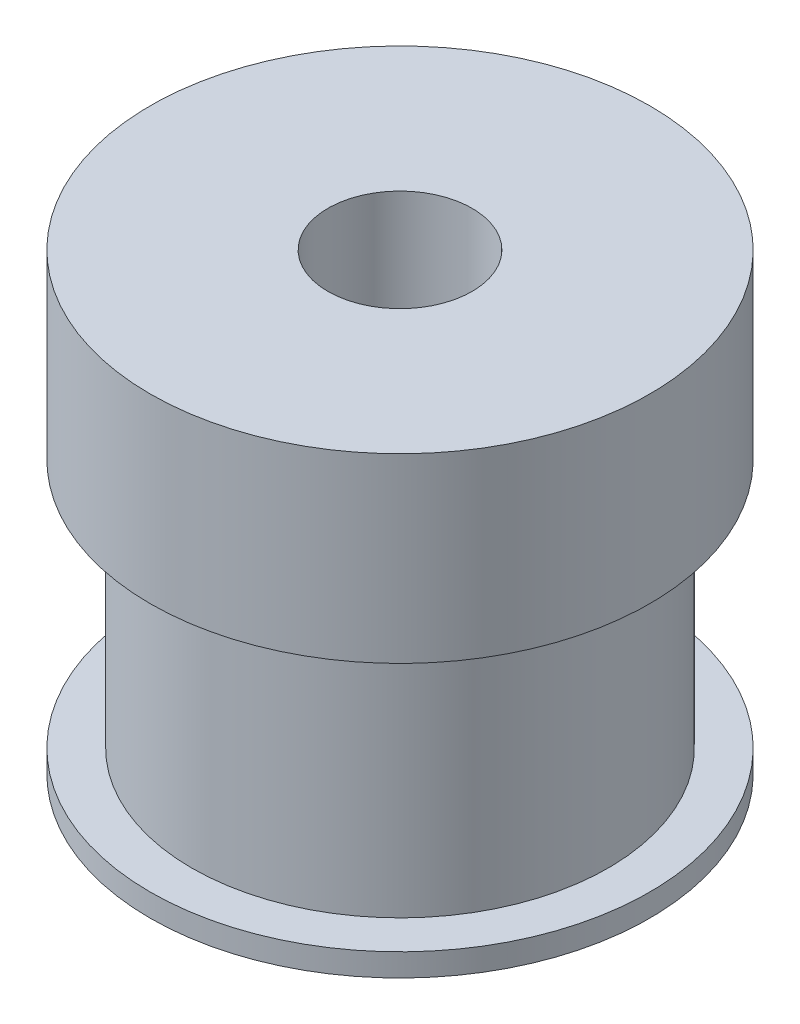
ISO-10303-21;
HEADER;
FILE_DESCRIPTION(('STEP AP214'),'2;1');
FILE_NAME('part.step','',(''),(''),'','','');
FILE_SCHEMA(('AUTOMOTIVE_DESIGN { 1 0 10303 214 1 1 1 1 }'));
ENDSEC;
DATA;
#1=APPLICATION_CONTEXT('core data for automotive mechanical design processes');
#2=APPLICATION_PROTOCOL_DEFINITION('international standard','automotive_design',2000,#1);
#3=PRODUCT_CONTEXT('',#1,'mechanical');
#4=PRODUCT('Part','Part','',(#3));
#5=PRODUCT_RELATED_PRODUCT_CATEGORY('part','',(#4));
#6=PRODUCT_DEFINITION_FORMATION('','',#4);
#7=PRODUCT_DEFINITION_CONTEXT('part definition',#1,'design');
#8=PRODUCT_DEFINITION('design','',#6,#7);
#9=PRODUCT_DEFINITION_SHAPE('','',#8);
#10=(LENGTH_UNIT() NAMED_UNIT(*) SI_UNIT(.MILLI.,.METRE.));
#11=(NAMED_UNIT(*) PLANE_ANGLE_UNIT() SI_UNIT($,.RADIAN.));
#12=(NAMED_UNIT(*) SI_UNIT($,.STERADIAN.) SOLID_ANGLE_UNIT());
#13=UNCERTAINTY_MEASURE_WITH_UNIT(LENGTH_MEASURE(1.E-05),#10,'distance_accuracy_value','');
#14=(GEOMETRIC_REPRESENTATION_CONTEXT(3) GLOBAL_UNCERTAINTY_ASSIGNED_CONTEXT((#13)) GLOBAL_UNIT_ASSIGNED_CONTEXT((#10,
#11,#12)) REPRESENTATION_CONTEXT('',''));
#15=CARTESIAN_POINT('',(0.,0.,0.));
#16=DIRECTION('',(0.,0.,1.));
#17=DIRECTION('',(1.,0.,0.));
#18=AXIS2_PLACEMENT_3D('',#15,#16,#17);
#19=CARTESIAN_POINT('',(0.,1.,0.));
#20=DIRECTION('',(0.,-1.,0.));
#21=DIRECTION('',(0.,0.,-1.));
#22=AXIS2_PLACEMENT_3D('',#19,#20,#21);
#23=CYLINDRICAL_SURFACE('',#22,11.);
#24=CARTESIAN_POINT('',(0.,1.,0.));
#25=DIRECTION('',(0.,1.,0.));
#26=DIRECTION('',(0.,0.,1.));
#27=AXIS2_PLACEMENT_3D('',#24,#25,#26);
#28=CIRCLE('',#27,11.);
#29=CARTESIAN_POINT('',(0.,1.,11.));
#30=VERTEX_POINT('',#29);
#31=EDGE_CURVE('E40',#30,#30,#28,.T.);
#32=ORIENTED_EDGE('',*,*,#31,.F.);
#33=EDGE_LOOP('',(#32));
#34=FACE_BOUND('',#33,.T.);
#35=CARTESIAN_POINT('',(0.,0.,0.));
#36=DIRECTION('',(0.,1.,0.));
#37=DIRECTION('',(0.,0.,1.));
#38=AXIS2_PLACEMENT_3D('',#35,#36,#37);
#39=CIRCLE('',#38,11.);
#40=CARTESIAN_POINT('',(0.,0.,11.));
#41=VERTEX_POINT('',#40);
#42=EDGE_CURVE('E36',#41,#41,#39,.T.);
#43=ORIENTED_EDGE('',*,*,#42,.T.);
#44=EDGE_LOOP('',(#43));
#45=FACE_BOUND('',#44,.T.);
#46=ADVANCED_FACE('F33',(#34,#45),#23,.T.);
#47=CARTESIAN_POINT('',(0.,1.,0.));
#48=DIRECTION('',(0.,1.,0.));
#49=DIRECTION('',(0.,0.,1.));
#50=AXIS2_PLACEMENT_3D('',#47,#48,#49);
#51=PLANE('',#50);
#52=CARTESIAN_POINT('',(0.,1.,0.));
#53=DIRECTION('',(0.,1.,0.));
#54=DIRECTION('',(0.,0.,1.));
#55=AXIS2_PLACEMENT_3D('',#52,#53,#54);
#56=CIRCLE('',#55,9.17);
#57=CARTESIAN_POINT('',(0.,1.,9.17));
#58=VERTEX_POINT('',#57);
#59=EDGE_CURVE('E10',#58,#58,#56,.T.);
#60=ORIENTED_EDGE('',*,*,#59,.F.);
#61=EDGE_LOOP('',(#60));
#62=FACE_BOUND('',#61,.T.);
#63=ORIENTED_EDGE('',*,*,#31,.T.);
#64=EDGE_LOOP('',(#63));
#65=FACE_BOUND('',#64,.T.);
#66=ADVANCED_FACE('F91',(#62,#65),#51,.T.);
#67=CARTESIAN_POINT('',(0.,0.,0.));
#68=DIRECTION('',(0.,1.,0.));
#69=DIRECTION('',(0.,0.,1.));
#70=AXIS2_PLACEMENT_3D('',#67,#68,#69);
#71=PLANE('',#70);
#72=CARTESIAN_POINT('',(0.,0.,0.));
#73=DIRECTION('',(0.,1.,0.));
#74=DIRECTION('',(0.,0.,1.));
#75=AXIS2_PLACEMENT_3D('',#72,#73,#74);
#76=CIRCLE('',#75,3.175);
#77=CARTESIAN_POINT('',(0.,0.,3.175));
#78=VERTEX_POINT('',#77);
#79=EDGE_CURVE('E53',#78,#78,#76,.T.);
#80=ORIENTED_EDGE('',*,*,#79,.T.);
#81=EDGE_LOOP('',(#80));
#82=FACE_BOUND('',#81,.T.);
#83=ORIENTED_EDGE('',*,*,#42,.F.);
#84=EDGE_LOOP('',(#83));
#85=FACE_BOUND('',#84,.T.);
#86=ADVANCED_FACE('F62',(#82,#85),#71,.F.);
#87=CARTESIAN_POINT('',(0.,12.,0.));
#88=DIRECTION('',(0.,-1.,0.));
#89=DIRECTION('',(0.,0.,-1.));
#90=AXIS2_PLACEMENT_3D('',#87,#88,#89);
#91=CYLINDRICAL_SURFACE('',#90,9.17);
#92=CARTESIAN_POINT('',(0.,12.,0.));
#93=DIRECTION('',(0.,1.,0.));
#94=DIRECTION('',(0.,0.,1.));
#95=AXIS2_PLACEMENT_3D('',#92,#93,#94);
#96=CIRCLE('',#95,9.17);
#97=CARTESIAN_POINT('',(0.,12.,9.17));
#98=VERTEX_POINT('',#97);
#99=EDGE_CURVE('E46',#98,#98,#96,.T.);
#100=ORIENTED_EDGE('',*,*,#99,.F.);
#101=EDGE_LOOP('',(#100));
#102=FACE_BOUND('',#101,.T.);
#103=ORIENTED_EDGE('',*,*,#59,.T.);
#104=EDGE_LOOP('',(#103));
#105=FACE_BOUND('',#104,.T.);
#106=ADVANCED_FACE('F81',(#102,#105),#91,.T.);
#107=CARTESIAN_POINT('',(0.,20.,0.));
#108=DIRECTION('',(0.,-1.,0.));
#109=DIRECTION('',(0.,0.,-1.));
#110=AXIS2_PLACEMENT_3D('',#107,#108,#109);
#111=CYLINDRICAL_SURFACE('',#110,11.);
#112=CARTESIAN_POINT('',(0.,20.,0.));
#113=DIRECTION('',(0.,1.,0.));
#114=DIRECTION('',(0.,0.,1.));
#115=AXIS2_PLACEMENT_3D('',#112,#113,#114);
#116=CIRCLE('',#115,11.);
#117=CARTESIAN_POINT('',(0.,20.,11.));
#118=VERTEX_POINT('',#117);
#119=EDGE_CURVE('E49',#118,#118,#116,.T.);
#120=ORIENTED_EDGE('',*,*,#119,.F.);
#121=EDGE_LOOP('',(#120));
#122=FACE_BOUND('',#121,.T.);
#123=CARTESIAN_POINT('',(0.,12.,0.));
#124=DIRECTION('',(0.,1.,0.));
#125=DIRECTION('',(0.,0.,1.));
#126=AXIS2_PLACEMENT_3D('',#123,#124,#125);
#127=CIRCLE('',#126,11.);
#128=CARTESIAN_POINT('',(0.,12.,11.));
#129=VERTEX_POINT('',#128);
#130=EDGE_CURVE('E50',#129,#129,#127,.T.);
#131=ORIENTED_EDGE('',*,*,#130,.T.);
#132=EDGE_LOOP('',(#131));
#133=FACE_BOUND('',#132,.T.);
#134=ADVANCED_FACE('F75',(#122,#133),#111,.T.);
#135=CARTESIAN_POINT('',(0.,20.,0.));
#136=DIRECTION('',(0.,1.,0.));
#137=DIRECTION('',(0.,0.,1.));
#138=AXIS2_PLACEMENT_3D('',#135,#136,#137);
#139=PLANE('',#138);
#140=CARTESIAN_POINT('',(0.,20.,0.));
#141=DIRECTION('',(0.,1.,0.));
#142=DIRECTION('',(0.,0.,1.));
#143=AXIS2_PLACEMENT_3D('',#140,#141,#142);
#144=CIRCLE('',#143,3.175);
#145=CARTESIAN_POINT('',(0.,20.,3.175));
#146=VERTEX_POINT('',#145);
#147=EDGE_CURVE('E56',#146,#146,#144,.T.);
#148=ORIENTED_EDGE('',*,*,#147,.F.);
#149=EDGE_LOOP('',(#148));
#150=FACE_BOUND('',#149,.T.);
#151=ORIENTED_EDGE('',*,*,#119,.T.);
#152=EDGE_LOOP('',(#151));
#153=FACE_BOUND('',#152,.T.);
#154=ADVANCED_FACE('F72',(#150,#153),#139,.T.);
#155=CARTESIAN_POINT('',(0.,12.,0.));
#156=DIRECTION('',(0.,1.,0.));
#157=DIRECTION('',(0.,0.,1.));
#158=AXIS2_PLACEMENT_3D('',#155,#156,#157);
#159=PLANE('',#158);
#160=ORIENTED_EDGE('',*,*,#99,.T.);
#161=EDGE_LOOP('',(#160));
#162=FACE_BOUND('',#161,.T.);
#163=ORIENTED_EDGE('',*,*,#130,.F.);
#164=EDGE_LOOP('',(#163));
#165=FACE_BOUND('',#164,.T.);
#166=ADVANCED_FACE('F68',(#162,#165),#159,.F.);
#167=CARTESIAN_POINT('',(0.,0.,0.));
#168=DIRECTION('',(0.,1.,0.));
#169=DIRECTION('',(0.,0.,1.));
#170=AXIS2_PLACEMENT_3D('',#167,#168,#169);
#171=CYLINDRICAL_SURFACE('',#170,3.175);
#172=ORIENTED_EDGE('',*,*,#79,.F.);
#173=EDGE_LOOP('',(#172));
#174=FACE_BOUND('',#173,.T.);
#175=ORIENTED_EDGE('',*,*,#147,.T.);
#176=EDGE_LOOP('',(#175));
#177=FACE_BOUND('',#176,.T.);
#178=ADVANCED_FACE('F65',(#174,#177),#171,.F.);
#179=CLOSED_SHELL('',(#46,#66,#86,#106,#134,#154,#166,#178));
#180=MANIFOLD_SOLID_BREP('B2',#179);
#181=ADVANCED_BREP_SHAPE_REPRESENTATION('',(#18,#180),#14);
#182=SHAPE_DEFINITION_REPRESENTATION(#9,#181);
ENDSEC;
END-ISO-10303-21;
